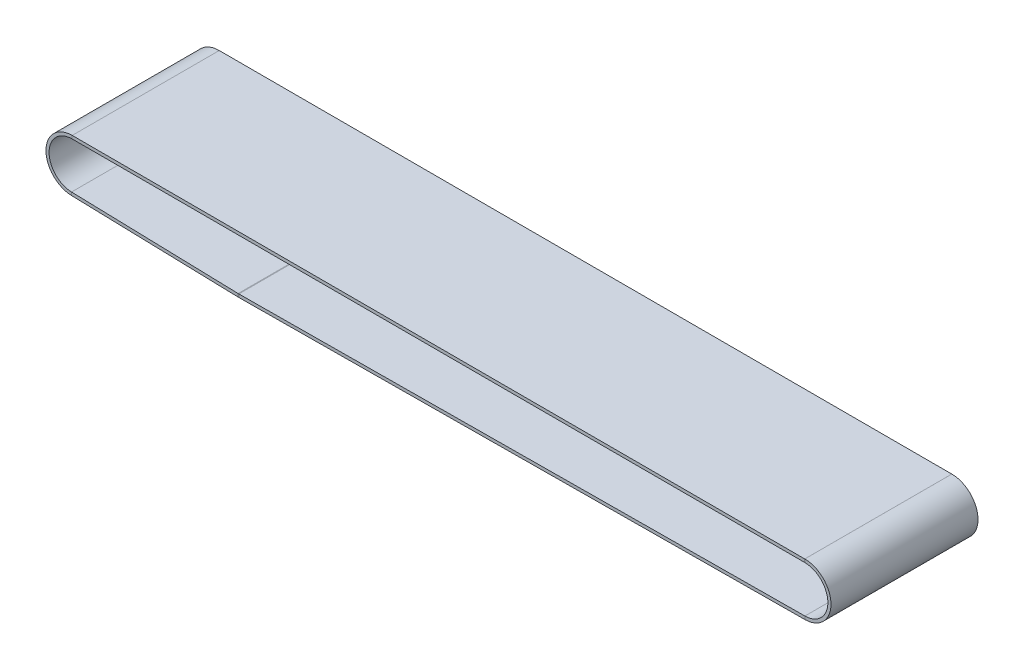
ISO-10303-21;
HEADER;
FILE_DESCRIPTION(('STEP AP214'),'2;1');
FILE_NAME('part.step','',(''),(''),'','','');
FILE_SCHEMA(('AUTOMOTIVE_DESIGN { 1 0 10303 214 1 1 1 1 }'));
ENDSEC;
DATA;
#1=APPLICATION_CONTEXT('core data for automotive mechanical design processes');
#2=APPLICATION_PROTOCOL_DEFINITION('international standard','automotive_design',2000,#1);
#3=PRODUCT_CONTEXT('',#1,'mechanical');
#4=PRODUCT('Part','Part','',(#3));
#5=PRODUCT_RELATED_PRODUCT_CATEGORY('part','',(#4));
#6=PRODUCT_DEFINITION_FORMATION('','',#4);
#7=PRODUCT_DEFINITION_CONTEXT('part definition',#1,'design');
#8=PRODUCT_DEFINITION('design','',#6,#7);
#9=PRODUCT_DEFINITION_SHAPE('','',#8);
#10=(LENGTH_UNIT() NAMED_UNIT(*) SI_UNIT(.MILLI.,.METRE.));
#11=(NAMED_UNIT(*) PLANE_ANGLE_UNIT() SI_UNIT($,.RADIAN.));
#12=(NAMED_UNIT(*) SI_UNIT($,.STERADIAN.) SOLID_ANGLE_UNIT());
#13=UNCERTAINTY_MEASURE_WITH_UNIT(LENGTH_MEASURE(1.E-05),#10,'distance_accuracy_value','');
#14=(GEOMETRIC_REPRESENTATION_CONTEXT(3) GLOBAL_UNCERTAINTY_ASSIGNED_CONTEXT((#13)) GLOBAL_UNIT_ASSIGNED_CONTEXT((#10,
#11,#12)) REPRESENTATION_CONTEXT('',''));
#15=CARTESIAN_POINT('',(0.,0.,0.));
#16=DIRECTION('',(0.,0.,1.));
#17=DIRECTION('',(1.,0.,0.));
#18=AXIS2_PLACEMENT_3D('',#15,#16,#17);
#19=CARTESIAN_POINT('',(-712.442239110561,25.9999944591829,-71.5));
#20=DIRECTION('',(0.000701795553085627,0.999999753741471,0.));
#21=DIRECTION('',(-0.999999753741471,0.000701795553085627,0.));
#22=AXIS2_PLACEMENT_3D('',#19,#20,#21);
#23=PLANE('',#22);
#24=DIRECTION('',(0.99999975374147,-0.000701795553085626,0.));
#25=VECTOR('',#24,1.);
#26=CARTESIAN_POINT('',(-712.442239110561,25.9999944591829,-71.5));
#27=LINE('',#26,#25);
#28=CARTESIAN_POINT('',(-712.442239110561,25.9999944591829,-71.5));
#29=VERTEX_POINT('',#28);
#30=CARTESIAN_POINT('',(0.,25.5000055408182,-71.5));
#31=VERTEX_POINT('',#30);
#32=EDGE_CURVE('E11',#29,#31,#27,.T.);
#33=ORIENTED_EDGE('',*,*,#32,.F.);
#34=DIRECTION('',(0.,0.,1.));
#35=VECTOR('',#34,1.);
#36=CARTESIAN_POINT('',(-712.442239110561,25.9999944591829,-71.5));
#37=LINE('',#36,#35);
#38=CARTESIAN_POINT('',(-712.442239110561,25.9999944591829,71.5));
#39=VERTEX_POINT('',#38);
#40=EDGE_CURVE('E40',#29,#39,#37,.T.);
#41=ORIENTED_EDGE('',*,*,#40,.T.);
#42=DIRECTION('',(0.99999975374147,-0.000701795553085626,0.));
#43=VECTOR('',#42,1.);
#44=CARTESIAN_POINT('',(-712.442239110561,25.9999944591829,71.5));
#45=LINE('',#44,#43);
#46=CARTESIAN_POINT('',(0.,25.5000055408182,71.5));
#47=VERTEX_POINT('',#46);
#48=EDGE_CURVE('E152',#39,#47,#45,.T.);
#49=ORIENTED_EDGE('',*,*,#48,.T.);
#50=DIRECTION('',(0.,0.,1.));
#51=VECTOR('',#50,1.);
#52=CARTESIAN_POINT('',(0.,25.5000055408182,-71.5));
#53=LINE('',#52,#51);
#54=EDGE_CURVE('E155',#31,#47,#53,.T.);
#55=ORIENTED_EDGE('',*,*,#54,.F.);
#56=EDGE_LOOP('',(#33,#41,#49,#55));
#57=FACE_BOUND('',#56,.T.);
#58=ADVANCED_FACE('F37',(#57),#23,.T.);
#59=CARTESIAN_POINT('',(-712.442239110561,22.9999944591829,-71.5));
#60=DIRECTION('',(0.,0.,-1.));
#61=DIRECTION('',(-1.,0.,0.));
#62=AXIS2_PLACEMENT_3D('',#59,#60,#61);
#63=PLANE('',#62);
#64=DIRECTION('',(0.99999975374147,-0.000701795553085626,0.));
#65=VECTOR('',#64,1.);
#66=CARTESIAN_POINT('',(-712.442239110561,22.9999944591829,-71.5));
#67=LINE('',#66,#65);
#68=CARTESIAN_POINT('',(-712.442239110561,22.9999944591829,-71.5));
#69=VERTEX_POINT('',#68);
#70=CARTESIAN_POINT('',(0.,22.5000055408182,-71.5));
#71=VERTEX_POINT('',#70);
#72=EDGE_CURVE('E45',#69,#71,#67,.T.);
#73=ORIENTED_EDGE('',*,*,#72,.F.);
#74=DIRECTION('',(0.,1.,0.));
#75=VECTOR('',#74,1.);
#76=CARTESIAN_POINT('',(-712.442239110561,22.9999944591829,-71.5));
#77=LINE('',#76,#75);
#78=EDGE_CURVE('E276',#69,#29,#77,.T.);
#79=ORIENTED_EDGE('',*,*,#78,.T.);
#80=ORIENTED_EDGE('',*,*,#32,.T.);
#81=DIRECTION('',(0.,1.,0.));
#82=VECTOR('',#81,1.);
#83=CARTESIAN_POINT('',(0.,22.5000055408182,-71.5));
#84=LINE('',#83,#82);
#85=EDGE_CURVE('E180',#71,#31,#84,.T.);
#86=ORIENTED_EDGE('',*,*,#85,.F.);
#87=EDGE_LOOP('',(#73,#79,#80,#86));
#88=FACE_BOUND('',#87,.T.);
#89=ADVANCED_FACE('F337',(#88),#63,.T.);
#90=CARTESIAN_POINT('',(-712.442239110561,22.9999944591829,71.5));
#91=DIRECTION('',(-0.000701795553085627,-0.999999753741471,0.));
#92=DIRECTION('',(0.999999753741471,-0.000701795553085627,0.));
#93=AXIS2_PLACEMENT_3D('',#90,#91,#92);
#94=PLANE('',#93);
#95=DIRECTION('',(0.99999975374147,-0.000701795553085626,0.));
#96=VECTOR('',#95,1.);
#97=CARTESIAN_POINT('',(-712.442239110561,22.9999944591829,71.5));
#98=LINE('',#97,#96);
#99=CARTESIAN_POINT('',(-712.442239110561,22.9999944591829,71.5));
#100=VERTEX_POINT('',#99);
#101=CARTESIAN_POINT('',(0.,22.5000055408182,71.5));
#102=VERTEX_POINT('',#101);
#103=EDGE_CURVE('E161',#100,#102,#98,.T.);
#104=ORIENTED_EDGE('',*,*,#103,.F.);
#105=DIRECTION('',(0.,0.,-1.));
#106=VECTOR('',#105,1.);
#107=CARTESIAN_POINT('',(-712.442239110561,22.9999944591829,71.5));
#108=LINE('',#107,#106);
#109=EDGE_CURVE('E239',#100,#69,#108,.T.);
#110=ORIENTED_EDGE('',*,*,#109,.T.);
#111=ORIENTED_EDGE('',*,*,#72,.T.);
#112=DIRECTION('',(0.,0.,-1.));
#113=VECTOR('',#112,1.);
#114=CARTESIAN_POINT('',(0.,22.5000055408182,71.5));
#115=LINE('',#114,#113);
#116=EDGE_CURVE('E184',#102,#71,#115,.T.);
#117=ORIENTED_EDGE('',*,*,#116,.F.);
#118=EDGE_LOOP('',(#104,#110,#111,#117));
#119=FACE_BOUND('',#118,.T.);
#120=ADVANCED_FACE('F341',(#119),#94,.T.);
#121=CARTESIAN_POINT('',(-712.458029510507,0.499999999999817,0.));
#122=DIRECTION('',(0.,0.,-1.));
#123=DIRECTION('',(-1.,0.,0.));
#124=AXIS2_PLACEMENT_3D('',#121,#122,#123);
#125=CYLINDRICAL_SURFACE('',#124,25.4999993481392);
#126=ORIENTED_EDGE('',*,*,#40,.F.);
#127=CARTESIAN_POINT('',(-712.458029510507,0.499999999999817,-71.5));
#128=DIRECTION('',(0.,0.,-1.));
#129=DIRECTION('',(-0.0276898770417164,-0.999616561842297,0.));
#130=AXIS2_PLACEMENT_3D('',#127,#128,#129);
#131=CIRCLE('',#130,25.4999993481392);
#132=CARTESIAN_POINT('',(-713.16412135702,-24.9902216753679,-71.5));
#133=VERTEX_POINT('',#132);
#134=EDGE_CURVE('E300',#133,#29,#131,.T.);
#135=ORIENTED_EDGE('',*,*,#134,.F.);
#136=DIRECTION('',(0.,0.,1.));
#137=VECTOR('',#136,1.);
#138=CARTESIAN_POINT('',(-713.16412135702,-24.9902216753679,-71.5));
#139=LINE('',#138,#137);
#140=CARTESIAN_POINT('',(-713.16412135702,-24.9902216753679,71.5));
#141=VERTEX_POINT('',#140);
#142=EDGE_CURVE('E242',#133,#141,#139,.T.);
#143=ORIENTED_EDGE('',*,*,#142,.T.);
#144=CARTESIAN_POINT('',(-712.458029510507,0.499999999999817,71.5));
#145=DIRECTION('',(0.,0.,-1.));
#146=DIRECTION('',(-0.0276898770417164,-0.999616561842297,0.));
#147=AXIS2_PLACEMENT_3D('',#144,#145,#146);
#148=CIRCLE('',#147,25.4999993481392);
#149=EDGE_CURVE('E236',#141,#39,#148,.T.);
#150=ORIENTED_EDGE('',*,*,#149,.T.);
#151=EDGE_LOOP('',(#126,#135,#143,#150));
#152=FACE_BOUND('',#151,.T.);
#153=ADVANCED_FACE('F313',(#152),#125,.T.);
#154=CARTESIAN_POINT('',(-713.082908723669,-21.991321125469,-71.5));
#155=DIRECTION('',(0.,0.,-1.));
#156=DIRECTION('',(-1.,0.,0.));
#157=AXIS2_PLACEMENT_3D('',#154,#155,#156);
#158=PLANE('',#157);
#159=ORIENTED_EDGE('',*,*,#134,.T.);
#160=ORIENTED_EDGE('',*,*,#78,.F.);
#161=CARTESIAN_POINT('',(-712.458029510507,0.499999999999817,-71.5));
#162=DIRECTION('',(0.,0.,-1.));
#163=DIRECTION('',(-0.0277724094739066,-0.999614272243056,0.));
#164=AXIS2_PLACEMENT_3D('',#161,#162,#163);
#165=CIRCLE('',#164,22.5);
#166=CARTESIAN_POINT('',(-713.082908723669,-21.991321125469,-71.5));
#167=VERTEX_POINT('',#166);
#168=EDGE_CURVE('E273',#167,#69,#165,.T.);
#169=ORIENTED_EDGE('',*,*,#168,.F.);
#170=DIRECTION('',(-0.0270708777836105,-0.999633516632983,0.));
#171=VECTOR('',#170,1.);
#172=CARTESIAN_POINT('',(-713.082908723669,-21.991321125469,-71.5));
#173=LINE('',#172,#171);
#174=EDGE_CURVE('E269',#167,#133,#173,.T.);
#175=ORIENTED_EDGE('',*,*,#174,.T.);
#176=EDGE_LOOP('',(#159,#160,#169,#175));
#177=FACE_BOUND('',#176,.T.);
#178=ADVANCED_FACE('F350',(#177),#158,.T.);
#179=CARTESIAN_POINT('',(-712.458029510507,0.499999999999817,0.));
#180=DIRECTION('',(0.,0.,-1.));
#181=DIRECTION('',(-1.,0.,0.));
#182=AXIS2_PLACEMENT_3D('',#179,#180,#181);
#183=CYLINDRICAL_SURFACE('',#182,22.5);
#184=ORIENTED_EDGE('',*,*,#168,.T.);
#185=ORIENTED_EDGE('',*,*,#109,.F.);
#186=CARTESIAN_POINT('',(-712.458029510507,0.499999999999817,71.5));
#187=DIRECTION('',(0.,0.,-1.));
#188=DIRECTION('',(-0.0277724094739066,-0.999614272243056,0.));
#189=AXIS2_PLACEMENT_3D('',#186,#187,#188);
#190=CIRCLE('',#189,22.5);
#191=CARTESIAN_POINT('',(-713.082908723669,-21.9913211254689,71.5));
#192=VERTEX_POINT('',#191);
#193=EDGE_CURVE('E235',#192,#100,#190,.T.);
#194=ORIENTED_EDGE('',*,*,#193,.F.);
#195=DIRECTION('',(0.,0.,-1.));
#196=VECTOR('',#195,1.);
#197=CARTESIAN_POINT('',(-713.082908723669,-21.9913211254689,71.5));
#198=LINE('',#197,#196);
#199=EDGE_CURVE('E228',#192,#167,#198,.T.);
#200=ORIENTED_EDGE('',*,*,#199,.T.);
#201=EDGE_LOOP('',(#184,#185,#194,#200));
#202=FACE_BOUND('',#201,.T.);
#203=ADVANCED_FACE('F321',(#202),#183,.F.);
#204=CARTESIAN_POINT('',(-713.16412135702,-24.9902216753679,71.5));
#205=DIRECTION('',(0.,0.,1.));
#206=DIRECTION('',(1.,0.,0.));
#207=AXIS2_PLACEMENT_3D('',#204,#205,#206);
#208=PLANE('',#207);
#209=ORIENTED_EDGE('',*,*,#193,.T.);
#210=DIRECTION('',(0.,-1.,0.));
#211=VECTOR('',#210,1.);
#212=CARTESIAN_POINT('',(-712.442239110561,25.9999944591829,71.5));
#213=LINE('',#212,#211);
#214=EDGE_CURVE('E233',#39,#100,#213,.T.);
#215=ORIENTED_EDGE('',*,*,#214,.F.);
#216=ORIENTED_EDGE('',*,*,#149,.F.);
#217=DIRECTION('',(0.0270708777836105,0.999633516632983,0.));
#218=VECTOR('',#217,1.);
#219=CARTESIAN_POINT('',(-713.16412135702,-24.9902216753679,71.5));
#220=LINE('',#219,#218);
#221=EDGE_CURVE('E225',#141,#192,#220,.T.);
#222=ORIENTED_EDGE('',*,*,#221,.T.);
#223=EDGE_LOOP('',(#209,#215,#216,#222));
#224=FACE_BOUND('',#223,.T.);
#225=ADVANCED_FACE('F318',(#224),#208,.T.);
#226=CARTESIAN_POINT('',(-551.160598517013,-29.4911859947601,-71.5));
#227=DIRECTION('',(-0.0277724094738643,-0.999614272243057,0.));
#228=DIRECTION('',(0.999614272243057,-0.0277724094738643,0.));
#229=AXIS2_PLACEMENT_3D('',#226,#227,#228);
#230=PLANE('',#229);
#231=ORIENTED_EDGE('',*,*,#142,.F.);
#232=DIRECTION('',(-0.999614272243057,0.0277724094738643,0.));
#233=VECTOR('',#232,1.);
#234=CARTESIAN_POINT('',(-551.160598517013,-29.4911859947601,-71.5));
#235=LINE('',#234,#233);
#236=CARTESIAN_POINT('',(-551.160598517013,-29.4911859947601,-71.5));
#237=VERTEX_POINT('',#236);
#238=EDGE_CURVE('E96',#237,#133,#235,.T.);
#239=ORIENTED_EDGE('',*,*,#238,.F.);
#240=DIRECTION('',(0.,0.,1.));
#241=VECTOR('',#240,1.);
#242=CARTESIAN_POINT('',(-551.160598517013,-29.4911859947601,-71.5));
#243=LINE('',#242,#241);
#244=CARTESIAN_POINT('',(-551.160598517013,-29.4911859947601,71.5));
#245=VERTEX_POINT('',#244);
#246=EDGE_CURVE('E232',#237,#245,#243,.T.);
#247=ORIENTED_EDGE('',*,*,#246,.T.);
#248=DIRECTION('',(-0.999614272243057,0.0277724094738643,0.));
#249=VECTOR('',#248,1.);
#250=CARTESIAN_POINT('',(-551.160598517013,-29.4911859947601,71.5));
#251=LINE('',#250,#249);
#252=EDGE_CURVE('E230',#245,#141,#251,.T.);
#253=ORIENTED_EDGE('',*,*,#252,.T.);
#254=EDGE_LOOP('',(#231,#239,#247,#253));
#255=FACE_BOUND('',#254,.T.);
#256=ADVANCED_FACE('F332',(#255),#230,.T.);
#257=CARTESIAN_POINT('',(-551.079385883662,-26.4922854448612,-71.5));
#258=DIRECTION('',(0.,0.,-1.));
#259=DIRECTION('',(-1.,0.,0.));
#260=AXIS2_PLACEMENT_3D('',#257,#258,#259);
#261=PLANE('',#260);
#262=ORIENTED_EDGE('',*,*,#238,.T.);
#263=ORIENTED_EDGE('',*,*,#174,.F.);
#264=DIRECTION('',(-0.999614272243057,0.0277724094738643,0.));
#265=VECTOR('',#264,1.);
#266=CARTESIAN_POINT('',(-551.079385883662,-26.4922854448612,-71.5));
#267=LINE('',#266,#265);
#268=CARTESIAN_POINT('',(-551.079385883662,-26.4922854448612,-71.5));
#269=VERTEX_POINT('',#268);
#270=EDGE_CURVE('E106',#269,#167,#267,.T.);
#271=ORIENTED_EDGE('',*,*,#270,.F.);
#272=DIRECTION('',(-0.0270708777836102,-0.999633516632983,0.));
#273=VECTOR('',#272,1.);
#274=CARTESIAN_POINT('',(-551.079385883662,-26.4922854448612,-71.5));
#275=LINE('',#274,#273);
#276=EDGE_CURVE('E266',#269,#237,#275,.T.);
#277=ORIENTED_EDGE('',*,*,#276,.T.);
#278=EDGE_LOOP('',(#262,#263,#271,#277));
#279=FACE_BOUND('',#278,.T.);
#280=ADVANCED_FACE('F324',(#279),#261,.T.);
#281=CARTESIAN_POINT('',(-551.079385883662,-26.4922854448611,71.5));
#282=DIRECTION('',(0.0277724094738643,0.999614272243057,0.));
#283=DIRECTION('',(-0.999614272243057,0.0277724094738643,0.));
#284=AXIS2_PLACEMENT_3D('',#281,#282,#283);
#285=PLANE('',#284);
#286=ORIENTED_EDGE('',*,*,#270,.T.);
#287=ORIENTED_EDGE('',*,*,#199,.F.);
#288=DIRECTION('',(-0.999614272243057,0.0277724094738643,0.));
#289=VECTOR('',#288,1.);
#290=CARTESIAN_POINT('',(-551.079385883662,-26.4922854448611,71.5));
#291=LINE('',#290,#289);
#292=CARTESIAN_POINT('',(-551.079385883662,-26.4922854448611,71.5));
#293=VERTEX_POINT('',#292);
#294=EDGE_CURVE('E114',#293,#192,#291,.T.);
#295=ORIENTED_EDGE('',*,*,#294,.F.);
#296=DIRECTION('',(0.,0.,-1.));
#297=VECTOR('',#296,1.);
#298=CARTESIAN_POINT('',(-551.079385883662,-26.4922854448611,71.5));
#299=LINE('',#298,#297);
#300=EDGE_CURVE('E221',#293,#269,#299,.T.);
#301=ORIENTED_EDGE('',*,*,#300,.T.);
#302=EDGE_LOOP('',(#286,#287,#295,#301));
#303=FACE_BOUND('',#302,.T.);
#304=ADVANCED_FACE('F322',(#303),#285,.T.);
#305=CARTESIAN_POINT('',(-551.160598517013,-29.4911859947601,71.5));
#306=DIRECTION('',(0.,0.,1.));
#307=DIRECTION('',(1.,0.,0.));
#308=AXIS2_PLACEMENT_3D('',#305,#306,#307);
#309=PLANE('',#308);
#310=ORIENTED_EDGE('',*,*,#294,.T.);
#311=ORIENTED_EDGE('',*,*,#221,.F.);
#312=ORIENTED_EDGE('',*,*,#252,.F.);
#313=DIRECTION('',(0.0270708777836102,0.999633516632983,0.));
#314=VECTOR('',#313,1.);
#315=CARTESIAN_POINT('',(-551.160598517013,-29.4911859947601,71.5));
#316=LINE('',#315,#314);
#317=EDGE_CURVE('E215',#245,#293,#316,.T.);
#318=ORIENTED_EDGE('',*,*,#317,.T.);
#319=EDGE_LOOP('',(#310,#311,#312,#318));
#320=FACE_BOUND('',#319,.T.);
#321=ADVANCED_FACE('F316',(#320),#309,.T.);
#322=CARTESIAN_POINT('',(-550.523937694184,-6.50000000000002,0.));
#323=DIRECTION('',(0.,0.,-1.));
#324=DIRECTION('',(-1.,0.,0.));
#325=AXIS2_PLACEMENT_3D('',#322,#323,#324);
#326=CYLINDRICAL_SURFACE('',#325,22.9999993575865);
#327=ORIENTED_EDGE('',*,*,#246,.F.);
#328=CARTESIAN_POINT('',(-550.523937694184,-6.50000000000002,-71.5));
#329=DIRECTION('',(0.,0.,-1.));
#330=DIRECTION('',(0.00735703023808908,-0.999972936686827,0.));
#331=AXIS2_PLACEMENT_3D('',#328,#329,#330);
#332=CIRCLE('',#331,22.9999993575865);
#333=CARTESIAN_POINT('',(-550.354726003434,-29.4993769014009,-71.5));
#334=VERTEX_POINT('',#333);
#335=EDGE_CURVE('E293',#334,#237,#332,.T.);
#336=ORIENTED_EDGE('',*,*,#335,.F.);
#337=DIRECTION('',(0.,0.,1.));
#338=VECTOR('',#337,1.);
#339=CARTESIAN_POINT('',(-550.354726003434,-29.4993769014009,-71.5));
#340=LINE('',#339,#338);
#341=CARTESIAN_POINT('',(-550.354726003434,-29.4993769014009,71.5));
#342=VERTEX_POINT('',#341);
#343=EDGE_CURVE('E224',#334,#342,#340,.T.);
#344=ORIENTED_EDGE('',*,*,#343,.T.);
#345=CARTESIAN_POINT('',(-550.523937694184,-6.50000000000002,71.5));
#346=DIRECTION('',(0.,0.,-1.));
#347=DIRECTION('',(0.00735703023808909,-0.999972936686827,0.));
#348=AXIS2_PLACEMENT_3D('',#345,#346,#347);
#349=CIRCLE('',#348,22.9999993575864);
#350=EDGE_CURVE('E218',#342,#245,#349,.T.);
#351=ORIENTED_EDGE('',*,*,#350,.T.);
#352=EDGE_LOOP('',(#327,#336,#344,#351));
#353=FACE_BOUND('',#352,.T.);
#354=ADVANCED_FACE('F330',(#353),#326,.T.);
#355=CARTESIAN_POINT('',(-550.378627811551,-26.4994721189838,-71.5));
#356=DIRECTION('',(0.,0.,-1.));
#357=DIRECTION('',(-1.,0.,0.));
#358=AXIS2_PLACEMENT_3D('',#355,#356,#357);
#359=PLANE('',#358);
#360=ORIENTED_EDGE('',*,*,#335,.T.);
#361=ORIENTED_EDGE('',*,*,#276,.F.);
#362=CARTESIAN_POINT('',(-550.523937694184,-6.50000000000002,-71.5));
#363=DIRECTION('',(0.,0.,-1.));
#364=DIRECTION('',(0.00726549413163634,-0.999973605949189,0.));
#365=AXIS2_PLACEMENT_3D('',#362,#363,#364);
#366=CIRCLE('',#365,20.);
#367=CARTESIAN_POINT('',(-550.378627811551,-26.4994721189838,-71.5));
#368=VERTEX_POINT('',#367);
#369=EDGE_CURVE('E263',#368,#269,#366,.T.);
#370=ORIENTED_EDGE('',*,*,#369,.F.);
#371=DIRECTION('',(0.0079672693723541,-0.999968260805686,0.));
#372=VECTOR('',#371,1.);
#373=CARTESIAN_POINT('',(-550.378627811551,-26.4994721189838,-71.5));
#374=LINE('',#373,#372);
#375=EDGE_CURVE('E261',#368,#334,#374,.T.);
#376=ORIENTED_EDGE('',*,*,#375,.T.);
#377=EDGE_LOOP('',(#360,#361,#370,#376));
#378=FACE_BOUND('',#377,.T.);
#379=ADVANCED_FACE('F369',(#378),#359,.T.);
#380=CARTESIAN_POINT('',(-550.523937694184,-6.50000000000002,0.));
#381=DIRECTION('',(0.,0.,-1.));
#382=DIRECTION('',(-1.,0.,0.));
#383=AXIS2_PLACEMENT_3D('',#380,#381,#382);
#384=CYLINDRICAL_SURFACE('',#383,20.);
#385=ORIENTED_EDGE('',*,*,#369,.T.);
#386=ORIENTED_EDGE('',*,*,#300,.F.);
#387=CARTESIAN_POINT('',(-550.523937694184,-6.50000000000002,71.5));
#388=DIRECTION('',(0.,0.,-1.));
#389=DIRECTION('',(0.00726549413163635,-0.999973605949189,0.));
#390=AXIS2_PLACEMENT_3D('',#387,#388,#389);
#391=CIRCLE('',#390,20.);
#392=CARTESIAN_POINT('',(-550.378627811551,-26.4994721189838,71.5));
#393=VERTEX_POINT('',#392);
#394=EDGE_CURVE('E217',#393,#293,#391,.T.);
#395=ORIENTED_EDGE('',*,*,#394,.F.);
#396=DIRECTION('',(0.,0.,-1.));
#397=VECTOR('',#396,1.);
#398=CARTESIAN_POINT('',(-550.378627811551,-26.4994721189838,71.5));
#399=LINE('',#398,#397);
#400=EDGE_CURVE('E211',#393,#368,#399,.T.);
#401=ORIENTED_EDGE('',*,*,#400,.T.);
#402=EDGE_LOOP('',(#385,#386,#395,#401));
#403=FACE_BOUND('',#402,.T.);
#404=ADVANCED_FACE('F407',(#403),#384,.F.);
#405=CARTESIAN_POINT('',(-550.354726003434,-29.4993769014009,71.5));
#406=DIRECTION('',(0.,0.,1.));
#407=DIRECTION('',(1.,0.,0.));
#408=AXIS2_PLACEMENT_3D('',#405,#406,#407);
#409=PLANE('',#408);
#410=ORIENTED_EDGE('',*,*,#394,.T.);
#411=ORIENTED_EDGE('',*,*,#317,.F.);
#412=ORIENTED_EDGE('',*,*,#350,.F.);
#413=DIRECTION('',(-0.0079672693723541,0.999968260805686,0.));
#414=VECTOR('',#413,1.);
#415=CARTESIAN_POINT('',(-550.354726003434,-29.4993769014009,71.5));
#416=LINE('',#415,#414);
#417=EDGE_CURVE('E204',#342,#393,#416,.T.);
#418=ORIENTED_EDGE('',*,*,#417,.T.);
#419=EDGE_LOOP('',(#410,#411,#412,#418));
#420=FACE_BOUND('',#419,.T.);
#421=ADVANCED_FACE('F365',(#420),#409,.T.);
#422=CARTESIAN_POINT('',(0.187375426078773,-25.4993109162739,-71.5));
#423=DIRECTION('',(0.00726549413168587,-0.999973605949188,0.));
#424=DIRECTION('',(0.999973605949188,0.00726549413168587,0.));
#425=AXIS2_PLACEMENT_3D('',#422,#423,#424);
#426=PLANE('',#425);
#427=ORIENTED_EDGE('',*,*,#343,.F.);
#428=DIRECTION('',(-0.999973605949188,-0.00726549413168587,0.));
#429=VECTOR('',#428,1.);
#430=CARTESIAN_POINT('',(0.187375426078773,-25.4993109162739,-71.5));
#431=LINE('',#430,#429);
#432=CARTESIAN_POINT('',(0.187375426078798,-25.4993109162739,-71.5));
#433=VERTEX_POINT('',#432);
#434=EDGE_CURVE('E289',#433,#334,#431,.T.);
#435=ORIENTED_EDGE('',*,*,#434,.F.);
#436=DIRECTION('',(0.,0.,1.));
#437=VECTOR('',#436,1.);
#438=CARTESIAN_POINT('',(0.187375426078793,-25.4993109162739,-71.5));
#439=LINE('',#438,#437);
#440=CARTESIAN_POINT('',(0.187375426078798,-25.4993109162739,71.5));
#441=VERTEX_POINT('',#440);
#442=EDGE_CURVE('E214',#433,#441,#439,.T.);
#443=ORIENTED_EDGE('',*,*,#442,.T.);
#444=DIRECTION('',(-0.999973605949188,-0.00726549413168587,0.));
#445=VECTOR('',#444,1.);
#446=CARTESIAN_POINT('',(0.187375426078773,-25.4993109162739,71.5));
#447=LINE('',#446,#445);
#448=EDGE_CURVE('E208',#441,#342,#447,.T.);
#449=ORIENTED_EDGE('',*,*,#448,.T.);
#450=EDGE_LOOP('',(#427,#435,#443,#449));
#451=FACE_BOUND('',#450,.T.);
#452=ADVANCED_FACE('F361',(#451),#426,.T.);
#453=CARTESIAN_POINT('',(0.163473617961711,-22.4994061338568,-71.5));
#454=DIRECTION('',(0.,0.,-1.));
#455=DIRECTION('',(-1.,0.,0.));
#456=AXIS2_PLACEMENT_3D('',#453,#454,#455);
#457=PLANE('',#456);
#458=ORIENTED_EDGE('',*,*,#434,.T.);
#459=ORIENTED_EDGE('',*,*,#375,.F.);
#460=DIRECTION('',(-0.999973605949188,-0.00726549413168587,0.));
#461=VECTOR('',#460,1.);
#462=CARTESIAN_POINT('',(0.163473617961711,-22.4994061338568,-71.5));
#463=LINE('',#462,#461);
#464=CARTESIAN_POINT('',(0.163473617961733,-22.4994061338568,-71.5));
#465=VERTEX_POINT('',#464);
#466=EDGE_CURVE('E258',#465,#368,#463,.T.);
#467=ORIENTED_EDGE('',*,*,#466,.F.);
#468=DIRECTION('',(0.00796726937235486,-0.999968260805686,0.));
#469=VECTOR('',#468,1.);
#470=CARTESIAN_POINT('',(0.163473617961728,-22.4994061338568,-71.5));
#471=LINE('',#470,#469);
#472=EDGE_CURVE('E255',#465,#433,#471,.T.);
#473=ORIENTED_EDGE('',*,*,#472,.T.);
#474=EDGE_LOOP('',(#458,#459,#467,#473));
#475=FACE_BOUND('',#474,.T.);
#476=ADVANCED_FACE('F364',(#475),#457,.T.);
#477=CARTESIAN_POINT('',(0.163473617961711,-22.4994061338568,71.5));
#478=DIRECTION('',(-0.00726549413168587,0.999973605949188,0.));
#479=DIRECTION('',(-0.999973605949188,-0.00726549413168587,0.));
#480=AXIS2_PLACEMENT_3D('',#477,#478,#479);
#481=PLANE('',#480);
#482=ORIENTED_EDGE('',*,*,#466,.T.);
#483=ORIENTED_EDGE('',*,*,#400,.F.);
#484=DIRECTION('',(-0.999973605949188,-0.00726549413168587,0.));
#485=VECTOR('',#484,1.);
#486=CARTESIAN_POINT('',(0.163473617961711,-22.4994061338568,71.5));
#487=LINE('',#486,#485);
#488=CARTESIAN_POINT('',(0.163473617961732,-22.4994061338568,71.5));
#489=VERTEX_POINT('',#488);
#490=EDGE_CURVE('E207',#489,#393,#487,.T.);
#491=ORIENTED_EDGE('',*,*,#490,.F.);
#492=DIRECTION('',(0.,0.,-1.));
#493=VECTOR('',#492,1.);
#494=CARTESIAN_POINT('',(0.163473617961728,-22.4994061338568,71.5));
#495=LINE('',#494,#493);
#496=EDGE_CURVE('E200',#489,#465,#495,.T.);
#497=ORIENTED_EDGE('',*,*,#496,.T.);
#498=EDGE_LOOP('',(#482,#483,#491,#497));
#499=FACE_BOUND('',#498,.T.);
#500=ADVANCED_FACE('F393',(#499),#481,.T.);
#501=CARTESIAN_POINT('',(0.187375426078773,-25.4993109162739,71.5));
#502=DIRECTION('',(0.,0.,1.));
#503=DIRECTION('',(1.,0.,0.));
#504=AXIS2_PLACEMENT_3D('',#501,#502,#503);
#505=PLANE('',#504);
#506=ORIENTED_EDGE('',*,*,#490,.T.);
#507=ORIENTED_EDGE('',*,*,#417,.F.);
#508=ORIENTED_EDGE('',*,*,#448,.F.);
#509=DIRECTION('',(-0.00796726937235486,0.999968260805686,0.));
#510=VECTOR('',#509,1.);
#511=CARTESIAN_POINT('',(0.187375426078792,-25.4993109162739,71.5));
#512=LINE('',#511,#510);
#513=EDGE_CURVE('E193',#441,#489,#512,.T.);
#514=ORIENTED_EDGE('',*,*,#513,.T.);
#515=EDGE_LOOP('',(#506,#507,#508,#514));
#516=FACE_BOUND('',#515,.T.);
#517=ADVANCED_FACE('F359',(#516),#505,.T.);
#518=CARTESIAN_POINT('',(-2.22044604925031E-13,0.,0.));
#519=DIRECTION('',(0.,0.,-1.));
#520=DIRECTION('',(-1.,0.,0.));
#521=AXIS2_PLACEMENT_3D('',#518,#519,#520);
#522=CYLINDRICAL_SURFACE('',#521,25.4999993481392);
#523=ORIENTED_EDGE('',*,*,#442,.F.);
#524=CARTESIAN_POINT('',(-2.22044604925031E-13,0.,-71.5));
#525=DIRECTION('',(0.,0.,-1.));
#526=DIRECTION('',(0.000619231386238371,0.999999808276227,0.));
#527=AXIS2_PLACEMENT_3D('',#524,#525,#526);
#528=CIRCLE('',#527,25.4999993481392);
#529=CARTESIAN_POINT('',(0.015790399944815,25.499994459183,-71.5));
#530=VERTEX_POINT('',#529);
#531=EDGE_CURVE('E284',#530,#433,#528,.T.);
#532=ORIENTED_EDGE('',*,*,#531,.F.);
#533=DIRECTION('',(0.,0.,1.));
#534=VECTOR('',#533,1.);
#535=CARTESIAN_POINT('',(0.015790399944815,25.499994459183,-71.5));
#536=LINE('',#535,#534);
#537=CARTESIAN_POINT('',(0.015790399944815,25.499994459183,71.5));
#538=VERTEX_POINT('',#537);
#539=EDGE_CURVE('E203',#530,#538,#536,.T.);
#540=ORIENTED_EDGE('',*,*,#539,.T.);
#541=CARTESIAN_POINT('',(-2.22044604925031E-13,0.,71.5));
#542=DIRECTION('',(0.,0.,-1.));
#543=DIRECTION('',(0.000619231386238371,0.999999808276227,0.));
#544=AXIS2_PLACEMENT_3D('',#541,#542,#543);
#545=CIRCLE('',#544,25.4999993481392);
#546=EDGE_CURVE('E197',#538,#441,#545,.T.);
#547=ORIENTED_EDGE('',*,*,#546,.T.);
#548=EDGE_LOOP('',(#523,#532,#540,#547));
#549=FACE_BOUND('',#548,.T.);
#550=ADVANCED_FACE('F355',(#549),#522,.T.);
#551=CARTESIAN_POINT('',(0.0157903999452037,22.499994459183,-71.5));
#552=DIRECTION('',(0.,0.,-1.));
#553=DIRECTION('',(-1.,0.,0.));
#554=AXIS2_PLACEMENT_3D('',#551,#552,#553);
#555=PLANE('',#554);
#556=ORIENTED_EDGE('',*,*,#531,.T.);
#557=ORIENTED_EDGE('',*,*,#472,.F.);
#558=CARTESIAN_POINT('',(-2.22044604925031E-13,0.,-71.5));
#559=DIRECTION('',(0.,0.,-1.));
#560=DIRECTION('',(0.000701795553130034,0.999999753741471,0.));
#561=AXIS2_PLACEMENT_3D('',#558,#559,#560);
#562=CIRCLE('',#561,22.5);
#563=CARTESIAN_POINT('',(0.015790399944815,22.499994459183,-71.5));
#564=VERTEX_POINT('',#563);
#565=EDGE_CURVE('E252',#564,#465,#562,.T.);
#566=ORIENTED_EDGE('',*,*,#565,.F.);
#567=DIRECTION('',(0.,1.,0.));
#568=VECTOR('',#567,1.);
#569=CARTESIAN_POINT('',(0.015790399944815,22.499994459183,-71.5));
#570=LINE('',#569,#568);
#571=EDGE_CURVE('E249',#564,#530,#570,.T.);
#572=ORIENTED_EDGE('',*,*,#571,.T.);
#573=EDGE_LOOP('',(#556,#557,#566,#572));
#574=FACE_BOUND('',#573,.T.);
#575=ADVANCED_FACE('F358',(#574),#555,.T.);
#576=CARTESIAN_POINT('',(-2.22044604925031E-13,0.,0.));
#577=DIRECTION('',(0.,0.,-1.));
#578=DIRECTION('',(-1.,0.,0.));
#579=AXIS2_PLACEMENT_3D('',#576,#577,#578);
#580=CYLINDRICAL_SURFACE('',#579,22.5);
#581=ORIENTED_EDGE('',*,*,#565,.T.);
#582=ORIENTED_EDGE('',*,*,#496,.F.);
#583=CARTESIAN_POINT('',(-2.22044604925031E-13,0.,71.5));
#584=DIRECTION('',(0.,0.,-1.));
#585=DIRECTION('',(0.000701795553130035,0.99999975374147,0.));
#586=AXIS2_PLACEMENT_3D('',#583,#584,#585);
#587=CIRCLE('',#586,22.5);
#588=CARTESIAN_POINT('',(0.015790399944815,22.499994459183,71.5));
#589=VERTEX_POINT('',#588);
#590=EDGE_CURVE('E196',#589,#489,#587,.T.);
#591=ORIENTED_EDGE('',*,*,#590,.F.);
#592=DIRECTION('',(0.,0.,-1.));
#593=VECTOR('',#592,1.);
#594=CARTESIAN_POINT('',(0.015790399944815,22.499994459183,71.5));
#595=LINE('',#594,#593);
#596=EDGE_CURVE('E191',#589,#564,#595,.T.);
#597=ORIENTED_EDGE('',*,*,#596,.T.);
#598=EDGE_LOOP('',(#581,#582,#591,#597));
#599=FACE_BOUND('',#598,.T.);
#600=ADVANCED_FACE('F391',(#599),#580,.F.);
#601=CARTESIAN_POINT('',(0.0157903999452037,25.499994459183,71.5));
#602=DIRECTION('',(0.,0.,1.));
#603=DIRECTION('',(1.,0.,0.));
#604=AXIS2_PLACEMENT_3D('',#601,#602,#603);
#605=PLANE('',#604);
#606=ORIENTED_EDGE('',*,*,#590,.T.);
#607=ORIENTED_EDGE('',*,*,#513,.F.);
#608=ORIENTED_EDGE('',*,*,#546,.F.);
#609=DIRECTION('',(0.,-1.,0.));
#610=VECTOR('',#609,1.);
#611=CARTESIAN_POINT('',(0.015790399944815,25.499994459183,71.5));
#612=LINE('',#611,#610);
#613=EDGE_CURVE('E172',#538,#589,#612,.T.);
#614=ORIENTED_EDGE('',*,*,#613,.T.);
#615=EDGE_LOOP('',(#606,#607,#608,#614));
#616=FACE_BOUND('',#615,.T.);
#617=ADVANCED_FACE('F354',(#616),#605,.T.);
#618=CARTESIAN_POINT('',(0.,25.5000055408182,-71.5));
#619=DIRECTION('',(0.000701795553085626,0.99999975374147,0.));
#620=DIRECTION('',(-0.999999753741471,0.000701795553085626,0.));
#621=AXIS2_PLACEMENT_3D('',#618,#619,#620);
#622=PLANE('',#621);
#623=ORIENTED_EDGE('',*,*,#539,.F.);
#624=DIRECTION('',(0.99999975374147,-0.000701795553085626,0.));
#625=VECTOR('',#624,1.);
#626=CARTESIAN_POINT('',(0.,25.5000055408182,-71.5));
#627=LINE('',#626,#625);
#628=EDGE_CURVE('E179',#31,#530,#627,.T.);
#629=ORIENTED_EDGE('',*,*,#628,.F.);
#630=ORIENTED_EDGE('',*,*,#54,.T.);
#631=DIRECTION('',(0.99999975374147,-0.000701795553085626,0.));
#632=VECTOR('',#631,1.);
#633=CARTESIAN_POINT('',(0.,25.5000055408182,71.5));
#634=LINE('',#633,#632);
#635=EDGE_CURVE('E167',#47,#538,#634,.T.);
#636=ORIENTED_EDGE('',*,*,#635,.T.);
#637=EDGE_LOOP('',(#623,#629,#630,#636));
#638=FACE_BOUND('',#637,.T.);
#639=ADVANCED_FACE('F177',(#638),#622,.T.);
#640=CARTESIAN_POINT('',(0.,22.5000055408182,-71.5));
#641=DIRECTION('',(0.,0.,-1.));
#642=DIRECTION('',(-1.,0.,0.));
#643=AXIS2_PLACEMENT_3D('',#640,#641,#642);
#644=PLANE('',#643);
#645=ORIENTED_EDGE('',*,*,#628,.T.);
#646=ORIENTED_EDGE('',*,*,#571,.F.);
#647=DIRECTION('',(0.99999975374147,-0.000701795553085626,0.));
#648=VECTOR('',#647,1.);
#649=CARTESIAN_POINT('',(0.,22.5000055408182,-71.5));
#650=LINE('',#649,#648);
#651=EDGE_CURVE('E246',#71,#564,#650,.T.);
#652=ORIENTED_EDGE('',*,*,#651,.F.);
#653=ORIENTED_EDGE('',*,*,#85,.T.);
#654=EDGE_LOOP('',(#645,#646,#652,#653));
#655=FACE_BOUND('',#654,.T.);
#656=ADVANCED_FACE('F353',(#655),#644,.T.);
#657=CARTESIAN_POINT('',(0.,22.5000055408182,71.5));
#658=DIRECTION('',(-0.000701795553085626,-0.99999975374147,0.));
#659=DIRECTION('',(0.999999753741471,-0.000701795553085626,0.));
#660=AXIS2_PLACEMENT_3D('',#657,#658,#659);
#661=PLANE('',#660);
#662=ORIENTED_EDGE('',*,*,#651,.T.);
#663=ORIENTED_EDGE('',*,*,#596,.F.);
#664=DIRECTION('',(0.99999975374147,-0.000701795553085626,0.));
#665=VECTOR('',#664,1.);
#666=CARTESIAN_POINT('',(0.,22.5000055408182,71.5));
#667=LINE('',#666,#665);
#668=EDGE_CURVE('E190',#102,#589,#667,.T.);
#669=ORIENTED_EDGE('',*,*,#668,.F.);
#670=ORIENTED_EDGE('',*,*,#116,.T.);
#671=EDGE_LOOP('',(#662,#663,#669,#670));
#672=FACE_BOUND('',#671,.T.);
#673=ADVANCED_FACE('F384',(#672),#661,.T.);
#674=CARTESIAN_POINT('',(0.,25.5000055408182,71.5));
#675=DIRECTION('',(0.,0.,1.));
#676=DIRECTION('',(1.,0.,0.));
#677=AXIS2_PLACEMENT_3D('',#674,#675,#676);
#678=PLANE('',#677);
#679=ORIENTED_EDGE('',*,*,#668,.T.);
#680=ORIENTED_EDGE('',*,*,#613,.F.);
#681=ORIENTED_EDGE('',*,*,#635,.F.);
#682=DIRECTION('',(0.,-1.,0.));
#683=VECTOR('',#682,1.);
#684=CARTESIAN_POINT('',(0.,25.5000055408182,71.5));
#685=LINE('',#684,#683);
#686=EDGE_CURVE('E170',#47,#102,#685,.T.);
#687=ORIENTED_EDGE('',*,*,#686,.T.);
#688=EDGE_LOOP('',(#679,#680,#681,#687));
#689=FACE_BOUND('',#688,.T.);
#690=ADVANCED_FACE('F169',(#689),#678,.T.);
#691=CARTESIAN_POINT('',(-712.442239110561,25.9999944591829,71.5));
#692=DIRECTION('',(0.,0.,1.));
#693=DIRECTION('',(1.,0.,0.));
#694=AXIS2_PLACEMENT_3D('',#691,#692,#693);
#695=PLANE('',#694);
#696=ORIENTED_EDGE('',*,*,#214,.T.);
#697=ORIENTED_EDGE('',*,*,#103,.T.);
#698=ORIENTED_EDGE('',*,*,#686,.F.);
#699=ORIENTED_EDGE('',*,*,#48,.F.);
#700=EDGE_LOOP('',(#696,#697,#698,#699));
#701=FACE_BOUND('',#700,.T.);
#702=ADVANCED_FACE('F182',(#701),#695,.T.);
#703=CLOSED_SHELL('',(#58,#89,#120,#153,#178,#203,#225,#256,#280,#304,#321,#354,#379,#404,#421,
#452,#476,#500,#517,#550,#575,#600,#617,#639,#656,#673,#690,#702));
#704=MANIFOLD_SOLID_BREP('B2',#703);
#705=ADVANCED_BREP_SHAPE_REPRESENTATION('',(#18,#704),#14);
#706=SHAPE_DEFINITION_REPRESENTATION(#9,#705);
ENDSEC;
END-ISO-10303-21;
